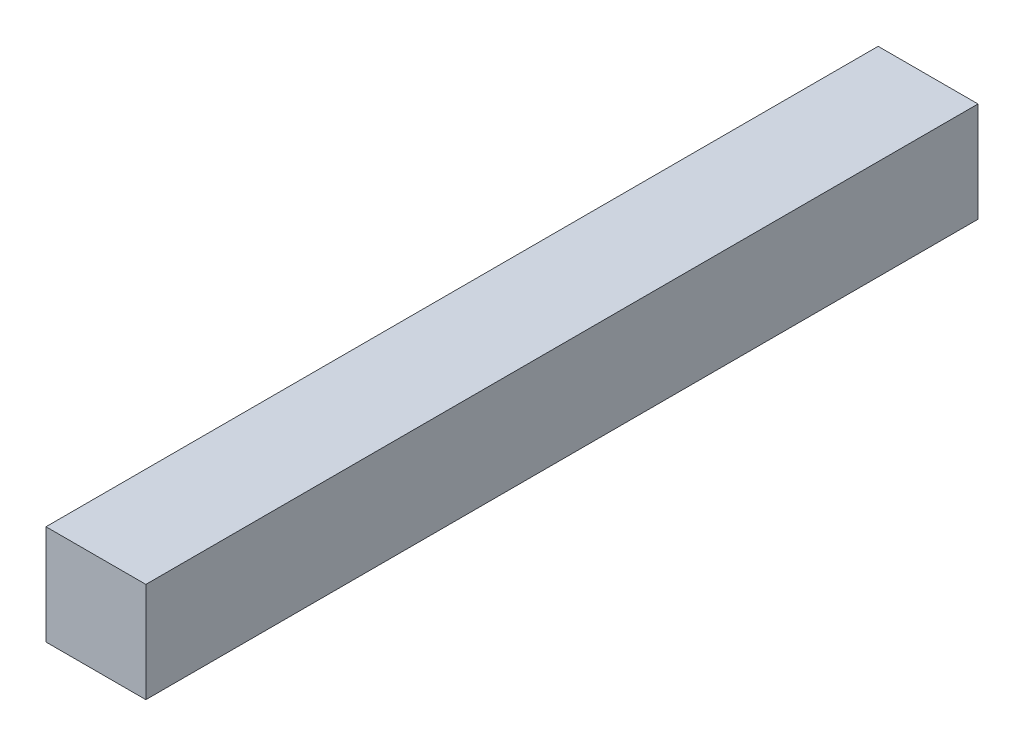
ISO-10303-21;
HEADER;
FILE_DESCRIPTION(('STEP AP214'),'2;1');
FILE_NAME('part.step','',(''),(''),'','','');
FILE_SCHEMA(('AUTOMOTIVE_DESIGN { 1 0 10303 214 1 1 1 1 }'));
ENDSEC;
DATA;
#1=APPLICATION_CONTEXT('core data for automotive mechanical design processes');
#2=APPLICATION_PROTOCOL_DEFINITION('international standard','automotive_design',2000,#1);
#3=PRODUCT_CONTEXT('',#1,'mechanical');
#4=PRODUCT('Part','Part','',(#3));
#5=PRODUCT_RELATED_PRODUCT_CATEGORY('part','',(#4));
#6=PRODUCT_DEFINITION_FORMATION('','',#4);
#7=PRODUCT_DEFINITION_CONTEXT('part definition',#1,'design');
#8=PRODUCT_DEFINITION('design','',#6,#7);
#9=PRODUCT_DEFINITION_SHAPE('','',#8);
#10=(LENGTH_UNIT() NAMED_UNIT(*) SI_UNIT(.MILLI.,.METRE.));
#11=(NAMED_UNIT(*) PLANE_ANGLE_UNIT() SI_UNIT($,.RADIAN.));
#12=(NAMED_UNIT(*) SI_UNIT($,.STERADIAN.) SOLID_ANGLE_UNIT());
#13=UNCERTAINTY_MEASURE_WITH_UNIT(LENGTH_MEASURE(1.E-05),#10,'distance_accuracy_value','');
#14=(GEOMETRIC_REPRESENTATION_CONTEXT(3) GLOBAL_UNCERTAINTY_ASSIGNED_CONTEXT((#13)) GLOBAL_UNIT_ASSIGNED_CONTEXT((#10,
#11,#12)) REPRESENTATION_CONTEXT('',''));
#15=CARTESIAN_POINT('',(0.,0.,0.));
#16=DIRECTION('',(0.,0.,1.));
#17=DIRECTION('',(1.,0.,0.));
#18=AXIS2_PLACEMENT_3D('',#15,#16,#17);
#19=CARTESIAN_POINT('',(-15.,-15.,250.));
#20=DIRECTION('',(0.,1.,0.));
#21=DIRECTION('',(0.,0.,1.));
#22=AXIS2_PLACEMENT_3D('',#19,#20,#21);
#23=PLANE('',#22);
#24=DIRECTION('',(0.,0.,1.));
#25=VECTOR('',#24,1.);
#26=CARTESIAN_POINT('',(10.,-15.,0.));
#27=LINE('',#26,#25);
#28=CARTESIAN_POINT('',(10.,-15.,225.));
#29=VERTEX_POINT('',#28);
#30=CARTESIAN_POINT('',(10.,-15.,245.));
#31=VERTEX_POINT('',#30);
#32=EDGE_CURVE('E173',#29,#31,#27,.T.);
#33=ORIENTED_EDGE('',*,*,#32,.F.);
#34=DIRECTION('',(1.,0.,0.));
#35=VECTOR('',#34,1.);
#36=CARTESIAN_POINT('',(0.,-15.,225.));
#37=LINE('',#36,#35);
#38=CARTESIAN_POINT('',(-9.99999999999999,-15.,225.));
#39=VERTEX_POINT('',#38);
#40=EDGE_CURVE('E61',#39,#29,#37,.T.);
#41=ORIENTED_EDGE('',*,*,#40,.F.);
#42=DIRECTION('',(0.,0.,-1.));
#43=VECTOR('',#42,1.);
#44=CARTESIAN_POINT('',(-9.99999999999994,-15.,0.));
#45=LINE('',#44,#43);
#46=CARTESIAN_POINT('',(-10.,-15.,245.));
#47=VERTEX_POINT('',#46);
#48=EDGE_CURVE('E160',#47,#39,#45,.T.);
#49=ORIENTED_EDGE('',*,*,#48,.F.);
#50=DIRECTION('',(-1.,0.,0.));
#51=VECTOR('',#50,1.);
#52=CARTESIAN_POINT('',(0.,-15.,245.));
#53=LINE('',#52,#51);
#54=EDGE_CURVE('E164',#31,#47,#53,.T.);
#55=ORIENTED_EDGE('',*,*,#54,.F.);
#56=EDGE_LOOP('',(#33,#41,#49,#55));
#57=FACE_BOUND('',#56,.T.);
#58=DIRECTION('',(1.,0.,0.));
#59=VECTOR('',#58,1.);
#60=CARTESIAN_POINT('',(-15.,-15.,0.));
#61=LINE('',#60,#59);
#62=CARTESIAN_POINT('',(-15.,-15.,0.));
#63=VERTEX_POINT('',#62);
#64=CARTESIAN_POINT('',(15.,-15.,0.));
#65=VERTEX_POINT('',#64);
#66=EDGE_CURVE('E232',#63,#65,#61,.T.);
#67=ORIENTED_EDGE('',*,*,#66,.T.);
#68=DIRECTION('',(0.,0.,-1.));
#69=VECTOR('',#68,1.);
#70=CARTESIAN_POINT('',(15.,-15.,250.));
#71=LINE('',#70,#69);
#72=CARTESIAN_POINT('',(15.,-15.,250.));
#73=VERTEX_POINT('',#72);
#74=EDGE_CURVE('E241',#73,#65,#71,.T.);
#75=ORIENTED_EDGE('',*,*,#74,.F.);
#76=DIRECTION('',(1.,0.,0.));
#77=VECTOR('',#76,1.);
#78=CARTESIAN_POINT('',(-15.,-15.,250.));
#79=LINE('',#78,#77);
#80=CARTESIAN_POINT('',(-15.,-15.,250.));
#81=VERTEX_POINT('',#80);
#82=EDGE_CURVE('E238',#81,#73,#79,.T.);
#83=ORIENTED_EDGE('',*,*,#82,.F.);
#84=DIRECTION('',(0.,0.,-1.));
#85=VECTOR('',#84,1.);
#86=CARTESIAN_POINT('',(-15.,-15.,250.));
#87=LINE('',#86,#85);
#88=EDGE_CURVE('E256',#81,#63,#87,.T.);
#89=ORIENTED_EDGE('',*,*,#88,.T.);
#90=EDGE_LOOP('',(#67,#75,#83,#89));
#91=FACE_BOUND('',#90,.T.);
#92=DIRECTION('',(0.,0.,1.));
#93=VECTOR('',#92,1.);
#94=CARTESIAN_POINT('',(-9.99999999999997,-15.,0.));
#95=LINE('',#94,#93);
#96=CARTESIAN_POINT('',(-9.99999999999997,-15.,5.));
#97=VERTEX_POINT('',#96);
#98=CARTESIAN_POINT('',(-9.99999999999997,-15.,25.));
#99=VERTEX_POINT('',#98);
#100=EDGE_CURVE('E69',#97,#99,#95,.T.);
#101=ORIENTED_EDGE('',*,*,#100,.T.);
#102=DIRECTION('',(1.,0.,0.));
#103=VECTOR('',#102,1.);
#104=CARTESIAN_POINT('',(0.,-15.,25.));
#105=LINE('',#104,#103);
#106=CARTESIAN_POINT('',(10.,-15.,25.));
#107=VERTEX_POINT('',#106);
#108=EDGE_CURVE('E194',#99,#107,#105,.T.);
#109=ORIENTED_EDGE('',*,*,#108,.T.);
#110=DIRECTION('',(0.,0.,-1.));
#111=VECTOR('',#110,1.);
#112=CARTESIAN_POINT('',(10.,-15.,0.));
#113=LINE('',#112,#111);
#114=CARTESIAN_POINT('',(10.,-15.,5.));
#115=VERTEX_POINT('',#114);
#116=EDGE_CURVE('E210',#107,#115,#113,.T.);
#117=ORIENTED_EDGE('',*,*,#116,.T.);
#118=DIRECTION('',(-1.,0.,0.));
#119=VECTOR('',#118,1.);
#120=CARTESIAN_POINT('',(0.,-15.,5.));
#121=LINE('',#120,#119);
#122=EDGE_CURVE('E206',#115,#97,#121,.T.);
#123=ORIENTED_EDGE('',*,*,#122,.T.);
#124=EDGE_LOOP('',(#101,#109,#117,#123));
#125=FACE_BOUND('',#124,.T.);
#126=ADVANCED_FACE('F45',(#57,#91,#125),#23,.F.);
#127=CARTESIAN_POINT('',(15.,-15.,250.));
#128=DIRECTION('',(-1.,0.,0.));
#129=DIRECTION('',(0.,-1.,0.));
#130=AXIS2_PLACEMENT_3D('',#127,#128,#129);
#131=PLANE('',#130);
#132=DIRECTION('',(0.,1.,0.));
#133=VECTOR('',#132,1.);
#134=CARTESIAN_POINT('',(15.,-15.,0.));
#135=LINE('',#134,#133);
#136=CARTESIAN_POINT('',(15.,15.,0.));
#137=VERTEX_POINT('',#136);
#138=EDGE_CURVE('E183',#65,#137,#135,.T.);
#139=ORIENTED_EDGE('',*,*,#138,.T.);
#140=DIRECTION('',(0.,0.,-1.));
#141=VECTOR('',#140,1.);
#142=CARTESIAN_POINT('',(15.,15.,250.));
#143=LINE('',#142,#141);
#144=CARTESIAN_POINT('',(15.,15.,250.));
#145=VERTEX_POINT('',#144);
#146=EDGE_CURVE('E11',#145,#137,#143,.T.);
#147=ORIENTED_EDGE('',*,*,#146,.F.);
#148=DIRECTION('',(0.,1.,0.));
#149=VECTOR('',#148,1.);
#150=CARTESIAN_POINT('',(15.,-15.,250.));
#151=LINE('',#150,#149);
#152=EDGE_CURVE('E227',#73,#145,#151,.T.);
#153=ORIENTED_EDGE('',*,*,#152,.F.);
#154=ORIENTED_EDGE('',*,*,#74,.T.);
#155=EDGE_LOOP('',(#139,#147,#153,#154));
#156=FACE_BOUND('',#155,.T.);
#157=ADVANCED_FACE('F47',(#156),#131,.F.);
#158=CARTESIAN_POINT('',(0.,15.,250.));
#159=DIRECTION('',(0.,-1.,0.));
#160=DIRECTION('',(0.,0.,-1.));
#161=AXIS2_PLACEMENT_3D('',#158,#159,#160);
#162=PLANE('',#161);
#163=DIRECTION('',(-1.,0.,0.));
#164=VECTOR('',#163,1.);
#165=CARTESIAN_POINT('',(0.,15.,0.));
#166=LINE('',#165,#164);
#167=CARTESIAN_POINT('',(-15.,15.,0.));
#168=VERTEX_POINT('',#167);
#169=EDGE_CURVE('E245',#137,#168,#166,.T.);
#170=ORIENTED_EDGE('',*,*,#169,.T.);
#171=DIRECTION('',(0.,0.,-1.));
#172=VECTOR('',#171,1.);
#173=CARTESIAN_POINT('',(-15.,15.,250.));
#174=LINE('',#173,#172);
#175=CARTESIAN_POINT('',(-15.,15.,250.));
#176=VERTEX_POINT('',#175);
#177=EDGE_CURVE('E54',#176,#168,#174,.T.);
#178=ORIENTED_EDGE('',*,*,#177,.F.);
#179=DIRECTION('',(-1.,0.,0.));
#180=VECTOR('',#179,1.);
#181=CARTESIAN_POINT('',(15.,15.,250.));
#182=LINE('',#181,#180);
#183=EDGE_CURVE('E231',#145,#176,#182,.T.);
#184=ORIENTED_EDGE('',*,*,#183,.F.);
#185=ORIENTED_EDGE('',*,*,#146,.T.);
#186=EDGE_LOOP('',(#170,#178,#184,#185));
#187=FACE_BOUND('',#186,.T.);
#188=ADVANCED_FACE('F281',(#187),#162,.F.);
#189=CARTESIAN_POINT('',(-15.,15.,250.));
#190=DIRECTION('',(1.,0.,0.));
#191=DIRECTION('',(0.,1.,0.));
#192=AXIS2_PLACEMENT_3D('',#189,#190,#191);
#193=PLANE('',#192);
#194=DIRECTION('',(0.,-1.,0.));
#195=VECTOR('',#194,1.);
#196=CARTESIAN_POINT('',(-15.,15.,0.));
#197=LINE('',#196,#195);
#198=EDGE_CURVE('E248',#168,#63,#197,.T.);
#199=ORIENTED_EDGE('',*,*,#198,.T.);
#200=ORIENTED_EDGE('',*,*,#88,.F.);
#201=DIRECTION('',(0.,-1.,0.));
#202=VECTOR('',#201,1.);
#203=CARTESIAN_POINT('',(-15.,15.,250.));
#204=LINE('',#203,#202);
#205=EDGE_CURVE('E235',#176,#81,#204,.T.);
#206=ORIENTED_EDGE('',*,*,#205,.F.);
#207=ORIENTED_EDGE('',*,*,#177,.T.);
#208=EDGE_LOOP('',(#199,#200,#206,#207));
#209=FACE_BOUND('',#208,.T.);
#210=ADVANCED_FACE('F265',(#209),#193,.F.);
#211=CARTESIAN_POINT('',(0.,0.,250.));
#212=DIRECTION('',(0.,0.,1.));
#213=DIRECTION('',(1.,0.,0.));
#214=AXIS2_PLACEMENT_3D('',#211,#212,#213);
#215=PLANE('',#214);
#216=ORIENTED_EDGE('',*,*,#152,.T.);
#217=ORIENTED_EDGE('',*,*,#183,.T.);
#218=ORIENTED_EDGE('',*,*,#205,.T.);
#219=ORIENTED_EDGE('',*,*,#82,.T.);
#220=EDGE_LOOP('',(#216,#217,#218,#219));
#221=FACE_BOUND('',#220,.T.);
#222=ADVANCED_FACE('F280',(#221),#215,.T.);
#223=CARTESIAN_POINT('',(0.,0.,0.));
#224=DIRECTION('',(0.,0.,1.));
#225=DIRECTION('',(1.,0.,0.));
#226=AXIS2_PLACEMENT_3D('',#223,#224,#225);
#227=PLANE('',#226);
#228=ORIENTED_EDGE('',*,*,#138,.F.);
#229=ORIENTED_EDGE('',*,*,#66,.F.);
#230=ORIENTED_EDGE('',*,*,#198,.F.);
#231=ORIENTED_EDGE('',*,*,#169,.F.);
#232=EDGE_LOOP('',(#228,#229,#230,#231));
#233=FACE_BOUND('',#232,.T.);
#234=ADVANCED_FACE('F271',(#233),#227,.F.);
#235=CARTESIAN_POINT('',(-9.99999999999997,5.00000000000001,0.));
#236=DIRECTION('',(1.,0.,0.));
#237=DIRECTION('',(0.,0.,-1.));
#238=AXIS2_PLACEMENT_3D('',#235,#236,#237);
#239=PLANE('',#238);
#240=ORIENTED_EDGE('',*,*,#100,.F.);
#241=DIRECTION('',(0.,-1.,0.));
#242=VECTOR('',#241,1.);
#243=CARTESIAN_POINT('',(-9.99999999999997,5.00000000000001,5.));
#244=LINE('',#243,#242);
#245=CARTESIAN_POINT('',(-9.99999999999997,5.00000000000001,5.));
#246=VERTEX_POINT('',#245);
#247=EDGE_CURVE('E203',#246,#97,#244,.T.);
#248=ORIENTED_EDGE('',*,*,#247,.F.);
#249=DIRECTION('',(0.,0.,1.));
#250=VECTOR('',#249,1.);
#251=CARTESIAN_POINT('',(-9.99999999999997,5.00000000000001,0.));
#252=LINE('',#251,#250);
#253=CARTESIAN_POINT('',(-9.99999999999997,5.00000000000001,25.));
#254=VERTEX_POINT('',#253);
#255=EDGE_CURVE('E189',#246,#254,#252,.T.);
#256=ORIENTED_EDGE('',*,*,#255,.T.);
#257=DIRECTION('',(0.,-1.,0.));
#258=VECTOR('',#257,1.);
#259=CARTESIAN_POINT('',(-9.99999999999997,5.00000000000001,25.));
#260=LINE('',#259,#258);
#261=EDGE_CURVE('E174',#254,#99,#260,.T.);
#262=ORIENTED_EDGE('',*,*,#261,.T.);
#263=EDGE_LOOP('',(#240,#248,#256,#262));
#264=FACE_BOUND('',#263,.T.);
#265=ADVANCED_FACE('F297',(#264),#239,.T.);
#266=CARTESIAN_POINT('',(0.,5.00000000000001,25.));
#267=DIRECTION('',(0.,0.,-1.));
#268=DIRECTION('',(-1.,0.,0.));
#269=AXIS2_PLACEMENT_3D('',#266,#267,#268);
#270=PLANE('',#269);
#271=ORIENTED_EDGE('',*,*,#108,.F.);
#272=ORIENTED_EDGE('',*,*,#261,.F.);
#273=DIRECTION('',(1.,0.,0.));
#274=VECTOR('',#273,1.);
#275=CARTESIAN_POINT('',(0.,5.00000000000001,25.));
#276=LINE('',#275,#274);
#277=CARTESIAN_POINT('',(10.,5.00000000000001,25.));
#278=VERTEX_POINT('',#277);
#279=EDGE_CURVE('E200',#254,#278,#276,.T.);
#280=ORIENTED_EDGE('',*,*,#279,.T.);
#281=DIRECTION('',(0.,-1.,0.));
#282=VECTOR('',#281,1.);
#283=CARTESIAN_POINT('',(10.,5.00000000000001,25.));
#284=LINE('',#283,#282);
#285=EDGE_CURVE('E219',#278,#107,#284,.T.);
#286=ORIENTED_EDGE('',*,*,#285,.T.);
#287=EDGE_LOOP('',(#271,#272,#280,#286));
#288=FACE_BOUND('',#287,.T.);
#289=ADVANCED_FACE('F301',(#288),#270,.T.);
#290=CARTESIAN_POINT('',(10.,5.00000000000001,0.));
#291=DIRECTION('',(-1.,0.,0.));
#292=DIRECTION('',(0.,0.,1.));
#293=AXIS2_PLACEMENT_3D('',#290,#291,#292);
#294=PLANE('',#293);
#295=ORIENTED_EDGE('',*,*,#116,.F.);
#296=ORIENTED_EDGE('',*,*,#285,.F.);
#297=DIRECTION('',(0.,0.,-1.));
#298=VECTOR('',#297,1.);
#299=CARTESIAN_POINT('',(10.,5.00000000000001,0.));
#300=LINE('',#299,#298);
#301=CARTESIAN_POINT('',(10.,5.00000000000001,5.));
#302=VERTEX_POINT('',#301);
#303=EDGE_CURVE('E197',#278,#302,#300,.T.);
#304=ORIENTED_EDGE('',*,*,#303,.T.);
#305=DIRECTION('',(0.,-1.,0.));
#306=VECTOR('',#305,1.);
#307=CARTESIAN_POINT('',(10.,5.00000000000001,5.));
#308=LINE('',#307,#306);
#309=EDGE_CURVE('E222',#302,#115,#308,.T.);
#310=ORIENTED_EDGE('',*,*,#309,.T.);
#311=EDGE_LOOP('',(#295,#296,#304,#310));
#312=FACE_BOUND('',#311,.T.);
#313=ADVANCED_FACE('F306',(#312),#294,.T.);
#314=CARTESIAN_POINT('',(0.,5.00000000000001,5.));
#315=DIRECTION('',(0.,0.,1.));
#316=DIRECTION('',(1.,0.,0.));
#317=AXIS2_PLACEMENT_3D('',#314,#315,#316);
#318=PLANE('',#317);
#319=ORIENTED_EDGE('',*,*,#122,.F.);
#320=ORIENTED_EDGE('',*,*,#309,.F.);
#321=DIRECTION('',(-1.,0.,0.));
#322=VECTOR('',#321,1.);
#323=CARTESIAN_POINT('',(0.,5.00000000000001,5.));
#324=LINE('',#323,#322);
#325=EDGE_CURVE('E193',#302,#246,#324,.T.);
#326=ORIENTED_EDGE('',*,*,#325,.T.);
#327=ORIENTED_EDGE('',*,*,#247,.T.);
#328=EDGE_LOOP('',(#319,#320,#326,#327));
#329=FACE_BOUND('',#328,.T.);
#330=ADVANCED_FACE('F302',(#329),#318,.T.);
#331=CARTESIAN_POINT('',(0.,5.00000000000001,0.));
#332=DIRECTION('',(0.,-1.,0.));
#333=DIRECTION('',(0.,0.,-1.));
#334=AXIS2_PLACEMENT_3D('',#331,#332,#333);
#335=PLANE('',#334);
#336=ORIENTED_EDGE('',*,*,#255,.F.);
#337=ORIENTED_EDGE('',*,*,#325,.F.);
#338=ORIENTED_EDGE('',*,*,#303,.F.);
#339=ORIENTED_EDGE('',*,*,#279,.F.);
#340=EDGE_LOOP('',(#336,#337,#338,#339));
#341=FACE_BOUND('',#340,.T.);
#342=ADVANCED_FACE('F305',(#341),#335,.T.);
#343=CARTESIAN_POINT('',(0.,5.00000000000001,225.));
#344=DIRECTION('',(0.,0.,-1.));
#345=DIRECTION('',(-1.,0.,0.));
#346=AXIS2_PLACEMENT_3D('',#343,#344,#345);
#347=PLANE('',#346);
#348=ORIENTED_EDGE('',*,*,#40,.T.);
#349=DIRECTION('',(0.,-1.,0.));
#350=VECTOR('',#349,1.);
#351=CARTESIAN_POINT('',(10.,5.00000000000001,225.));
#352=LINE('',#351,#350);
#353=CARTESIAN_POINT('',(10.,5.00000000000001,225.));
#354=VERTEX_POINT('',#353);
#355=EDGE_CURVE('E135',#354,#29,#352,.T.);
#356=ORIENTED_EDGE('',*,*,#355,.F.);
#357=DIRECTION('',(1.,0.,0.));
#358=VECTOR('',#357,1.);
#359=CARTESIAN_POINT('',(0.,5.00000000000001,225.));
#360=LINE('',#359,#358);
#361=CARTESIAN_POINT('',(-9.99999999999999,5.00000000000001,225.));
#362=VERTEX_POINT('',#361);
#363=EDGE_CURVE('E139',#362,#354,#360,.T.);
#364=ORIENTED_EDGE('',*,*,#363,.F.);
#365=DIRECTION('',(0.,-1.,0.));
#366=VECTOR('',#365,1.);
#367=CARTESIAN_POINT('',(-9.99999999999999,5.00000000000001,225.));
#368=LINE('',#367,#366);
#369=EDGE_CURVE('E180',#362,#39,#368,.T.);
#370=ORIENTED_EDGE('',*,*,#369,.T.);
#371=EDGE_LOOP('',(#348,#356,#364,#370));
#372=FACE_BOUND('',#371,.T.);
#373=ADVANCED_FACE('F137',(#372),#347,.F.);
#374=CARTESIAN_POINT('',(-9.99999999999994,5.00000000000001,0.));
#375=DIRECTION('',(-1.,0.,0.));
#376=DIRECTION('',(0.,0.,1.));
#377=AXIS2_PLACEMENT_3D('',#374,#375,#376);
#378=PLANE('',#377);
#379=ORIENTED_EDGE('',*,*,#48,.T.);
#380=ORIENTED_EDGE('',*,*,#369,.F.);
#381=DIRECTION('',(0.,0.,-1.));
#382=VECTOR('',#381,1.);
#383=CARTESIAN_POINT('',(-9.99999999999994,5.00000000000001,0.));
#384=LINE('',#383,#382);
#385=CARTESIAN_POINT('',(-10.,5.00000000000001,245.));
#386=VERTEX_POINT('',#385);
#387=EDGE_CURVE('E146',#386,#362,#384,.T.);
#388=ORIENTED_EDGE('',*,*,#387,.F.);
#389=DIRECTION('',(0.,-1.,0.));
#390=VECTOR('',#389,1.);
#391=CARTESIAN_POINT('',(-10.,5.00000000000001,245.));
#392=LINE('',#391,#390);
#393=EDGE_CURVE('E184',#386,#47,#392,.T.);
#394=ORIENTED_EDGE('',*,*,#393,.T.);
#395=EDGE_LOOP('',(#379,#380,#388,#394));
#396=FACE_BOUND('',#395,.T.);
#397=ADVANCED_FACE('F319',(#396),#378,.F.);
#398=CARTESIAN_POINT('',(0.,5.00000000000001,245.));
#399=DIRECTION('',(0.,0.,1.));
#400=DIRECTION('',(1.,0.,0.));
#401=AXIS2_PLACEMENT_3D('',#398,#399,#400);
#402=PLANE('',#401);
#403=ORIENTED_EDGE('',*,*,#54,.T.);
#404=ORIENTED_EDGE('',*,*,#393,.F.);
#405=DIRECTION('',(-1.,0.,0.));
#406=VECTOR('',#405,1.);
#407=CARTESIAN_POINT('',(0.,5.00000000000001,245.));
#408=LINE('',#407,#406);
#409=CARTESIAN_POINT('',(10.,5.00000000000001,245.));
#410=VERTEX_POINT('',#409);
#411=EDGE_CURVE('E155',#410,#386,#408,.T.);
#412=ORIENTED_EDGE('',*,*,#411,.F.);
#413=DIRECTION('',(0.,-1.,0.));
#414=VECTOR('',#413,1.);
#415=CARTESIAN_POINT('',(10.,5.00000000000001,245.));
#416=LINE('',#415,#414);
#417=EDGE_CURVE('E145',#410,#31,#416,.T.);
#418=ORIENTED_EDGE('',*,*,#417,.T.);
#419=EDGE_LOOP('',(#403,#404,#412,#418));
#420=FACE_BOUND('',#419,.T.);
#421=ADVANCED_FACE('F322',(#420),#402,.F.);
#422=CARTESIAN_POINT('',(10.,5.00000000000001,0.));
#423=DIRECTION('',(1.,0.,0.));
#424=DIRECTION('',(0.,0.,-1.));
#425=AXIS2_PLACEMENT_3D('',#422,#423,#424);
#426=PLANE('',#425);
#427=ORIENTED_EDGE('',*,*,#32,.T.);
#428=ORIENTED_EDGE('',*,*,#417,.F.);
#429=DIRECTION('',(0.,0.,1.));
#430=VECTOR('',#429,1.);
#431=CARTESIAN_POINT('',(10.,5.00000000000001,0.));
#432=LINE('',#431,#430);
#433=EDGE_CURVE('E149',#354,#410,#432,.T.);
#434=ORIENTED_EDGE('',*,*,#433,.F.);
#435=ORIENTED_EDGE('',*,*,#355,.T.);
#436=EDGE_LOOP('',(#427,#428,#434,#435));
#437=FACE_BOUND('',#436,.T.);
#438=ADVANCED_FACE('F150',(#437),#426,.F.);
#439=CARTESIAN_POINT('',(0.,5.00000000000001,0.));
#440=DIRECTION('',(0.,-1.,0.));
#441=DIRECTION('',(0.,0.,-1.));
#442=AXIS2_PLACEMENT_3D('',#439,#440,#441);
#443=PLANE('',#442);
#444=ORIENTED_EDGE('',*,*,#363,.T.);
#445=ORIENTED_EDGE('',*,*,#433,.T.);
#446=ORIENTED_EDGE('',*,*,#411,.T.);
#447=ORIENTED_EDGE('',*,*,#387,.T.);
#448=EDGE_LOOP('',(#444,#445,#446,#447));
#449=FACE_BOUND('',#448,.T.);
#450=ADVANCED_FACE('F157',(#449),#443,.T.);
#451=CLOSED_SHELL('',(#126,#157,#188,#210,#222,#234,#265,#289,#313,#330,#342,#373,#397,#421,
#438,#450));
#452=MANIFOLD_SOLID_BREP('B2',#451);
#453=ADVANCED_BREP_SHAPE_REPRESENTATION('',(#18,#452),#14);
#454=SHAPE_DEFINITION_REPRESENTATION(#9,#453);
ENDSEC;
END-ISO-10303-21;
